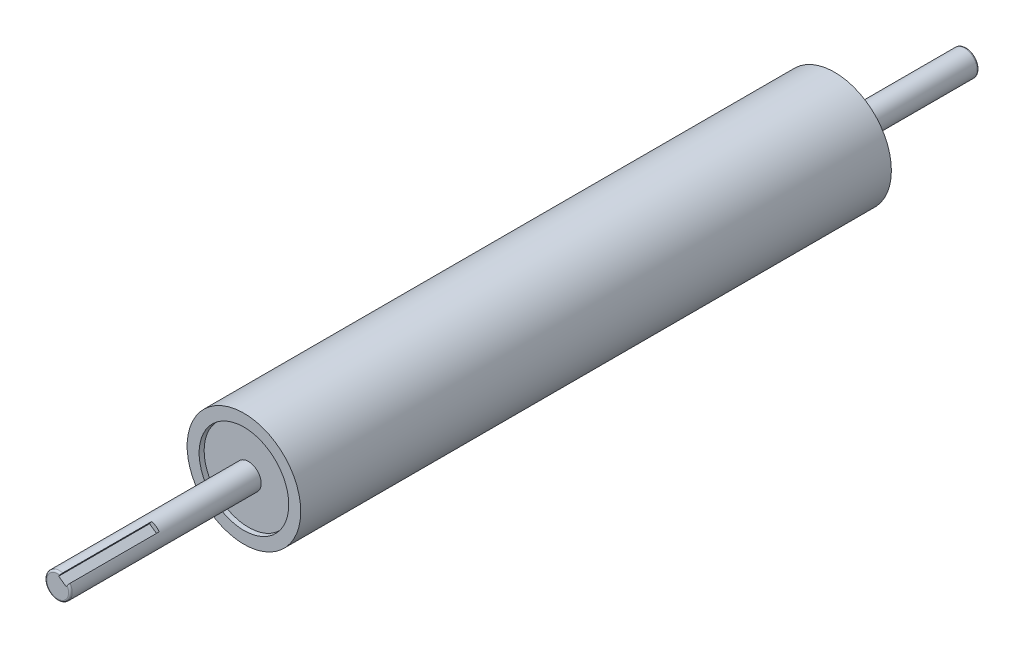
ISO-10303-21;
HEADER;
FILE_DESCRIPTION(('STEP AP214'),'2;1');
FILE_NAME('part.step','',(''),(''),'','','');
FILE_SCHEMA(('AUTOMOTIVE_DESIGN { 1 0 10303 214 1 1 1 1 }'));
ENDSEC;
DATA;
#1=APPLICATION_CONTEXT('core data for automotive mechanical design processes');
#2=APPLICATION_PROTOCOL_DEFINITION('international standard','automotive_design',2000,#1);
#3=PRODUCT_CONTEXT('',#1,'mechanical');
#4=PRODUCT('Part','Part','',(#3));
#5=PRODUCT_RELATED_PRODUCT_CATEGORY('part','',(#4));
#6=PRODUCT_DEFINITION_FORMATION('','',#4);
#7=PRODUCT_DEFINITION_CONTEXT('part definition',#1,'design');
#8=PRODUCT_DEFINITION('design','',#6,#7);
#9=PRODUCT_DEFINITION_SHAPE('','',#8);
#10=(LENGTH_UNIT() NAMED_UNIT(*) SI_UNIT(.MILLI.,.METRE.));
#11=(NAMED_UNIT(*) PLANE_ANGLE_UNIT() SI_UNIT($,.RADIAN.));
#12=(NAMED_UNIT(*) SI_UNIT($,.STERADIAN.) SOLID_ANGLE_UNIT());
#13=UNCERTAINTY_MEASURE_WITH_UNIT(LENGTH_MEASURE(1.E-05),#10,'distance_accuracy_value','');
#14=(GEOMETRIC_REPRESENTATION_CONTEXT(3) GLOBAL_UNCERTAINTY_ASSIGNED_CONTEXT((#13)) GLOBAL_UNIT_ASSIGNED_CONTEXT((#10,
#11,#12)) REPRESENTATION_CONTEXT('',''));
#15=CARTESIAN_POINT('',(0.,0.,0.));
#16=DIRECTION('',(0.,0.,1.));
#17=DIRECTION('',(1.,0.,0.));
#18=AXIS2_PLACEMENT_3D('',#15,#16,#17);
#19=CARTESIAN_POINT('',(286.827371054808,378.107018146906,769.17790576152));
#20=DIRECTION('',(0.,0.,-1.));
#21=DIRECTION('',(-0.695290896147707,0.718728439491661,0.));
#22=AXIS2_PLACEMENT_3D('',#19,#20,#21);
#23=CYLINDRICAL_SURFACE('',#22,48.8);
#24=CARTESIAN_POINT('',(286.827371054808,378.107018146906,769.17790576152));
#25=DIRECTION('',(0.,0.,1.));
#26=DIRECTION('',(0.695290896147707,-0.718728439491661,0.));
#27=AXIS2_PLACEMENT_3D('',#24,#25,#26);
#28=CIRCLE('',#27,48.8);
#29=CARTESIAN_POINT('',(320.757566786816,343.033070299713,769.17790576152));
#30=VERTEX_POINT('',#29);
#31=EDGE_CURVE('P0_E10',#30,#30,#28,.T.);
#32=ORIENTED_EDGE('',*,*,#31,.F.);
#33=EDGE_LOOP('',(#32));
#34=FACE_BOUND('',#33,.T.);
#35=CARTESIAN_POINT('',(286.827371054808,378.107018146906,762.17790576152));
#36=DIRECTION('',(0.,0.,1.));
#37=DIRECTION('',(0.695290896147707,-0.718728439491661,0.));
#38=AXIS2_PLACEMENT_3D('',#35,#36,#37);
#39=CIRCLE('',#38,48.8);
#40=CARTESIAN_POINT('',(320.757566786816,343.033070299713,762.17790576152));
#41=VERTEX_POINT('',#40);
#42=EDGE_CURVE('P0_E17',#41,#41,#39,.T.);
#43=ORIENTED_EDGE('',*,*,#42,.T.);
#44=EDGE_LOOP('',(#43));
#45=FACE_BOUND('',#44,.T.);
#46=ADVANCED_FACE('P0_F14',(#34,#45),#23,.T.);
#47=CARTESIAN_POINT('',(286.827371054808,378.107018146906,769.17790576152));
#48=DIRECTION('',(0.,0.,1.));
#49=DIRECTION('',(0.695290896147707,-0.718728439491661,0.));
#50=AXIS2_PLACEMENT_3D('',#47,#48,#49);
#51=PLANE('',#50);
#52=ORIENTED_EDGE('',*,*,#31,.T.);
#53=EDGE_LOOP('',(#52));
#54=FACE_BOUND('',#53,.T.);
#55=ADVANCED_FACE('P0_F29',(#54),#51,.T.);
#56=CARTESIAN_POINT('',(286.827371054808,378.107018146906,762.17790576152));
#57=DIRECTION('',(0.,0.,1.));
#58=DIRECTION('',(0.695290896147707,-0.718728439491661,0.));
#59=AXIS2_PLACEMENT_3D('',#56,#57,#58);
#60=PLANE('',#59);
#61=ORIENTED_EDGE('',*,*,#42,.F.);
#62=EDGE_LOOP('',(#61));
#63=FACE_BOUND('',#62,.T.);
#64=ADVANCED_FACE('P0_F27',(#63),#60,.F.);
#65=CLOSED_SHELL('',(#46,#55,#64));
#66=MANIFOLD_SOLID_BREP('P0_B1',#65);
#67=CARTESIAN_POINT('',(286.827371054808,378.107018146906,769.17790576152));
#68=DIRECTION('',(0.,0.,1.));
#69=DIRECTION('',(0.581871758152721,0.813280552493579,0.));
#70=AXIS2_PLACEMENT_3D('',#67,#68,#69);
#71=CYLINDRICAL_SURFACE('',#70,14.);
#72=CARTESIAN_POINT('',(286.827371054808,378.107018146906,769.17790576152));
#73=DIRECTION('',(0.,0.,-1.));
#74=DIRECTION('',(-0.581871758152721,-0.813280552493579,0.));
#75=AXIS2_PLACEMENT_3D('',#72,#73,#74);
#76=CIRCLE('',#75,14.);
#77=CARTESIAN_POINT('',(278.68116644067,366.721090411996,769.17790576152));
#78=VERTEX_POINT('',#77);
#79=EDGE_CURVE('P1_E99',#78,#78,#76,.T.);
#80=ORIENTED_EDGE('',*,*,#79,.F.);
#81=EDGE_LOOP('',(#80));
#82=FACE_BOUND('',#81,.T.);
#83=DIRECTION('',(0.,0.,1.));
#84=VECTOR('',#83,1.);
#85=CARTESIAN_POINT('',(298.50273439294,385.832682579342,769.17790576152));
#86=LINE('',#85,#84);
#87=CARTESIAN_POINT('',(298.50273439294,385.832682579342,879.17790576152));
#88=VERTEX_POINT('',#87);
#89=CARTESIAN_POINT('',(298.50273439294,385.832682579342,977.17790576152));
#90=VERTEX_POINT('',#89);
#91=EDGE_CURVE('P1_E96',#88,#90,#86,.T.);
#92=ORIENTED_EDGE('',*,*,#91,.T.);
#93=CARTESIAN_POINT('',(286.827371054808,378.107018146906,977.17790576152));
#94=DIRECTION('',(0.,0.,-1.));
#95=DIRECTION('',(-0.581871758152721,-0.813280552493579,0.));
#96=AXIS2_PLACEMENT_3D('',#93,#94,#95);
#97=CIRCLE('',#96,14.);
#98=CARTESIAN_POINT('',(290.369928868004,391.651400160869,977.17790576152));
#99=VERTEX_POINT('',#98);
#100=EDGE_CURVE('P1_E108',#90,#99,#97,.T.);
#101=ORIENTED_EDGE('',*,*,#100,.T.);
#102=DIRECTION('',(0.,0.,1.));
#103=VECTOR('',#102,1.);
#104=CARTESIAN_POINT('',(290.369928868004,391.651400160869,769.17790576152));
#105=LINE('',#104,#103);
#106=CARTESIAN_POINT('',(290.369928868004,391.651400160869,879.17790576152));
#107=VERTEX_POINT('',#106);
#108=EDGE_CURVE('P1_E93',#99,#107,#105,.F.);
#109=ORIENTED_EDGE('',*,*,#108,.T.);
#110=CARTESIAN_POINT('',(286.827371054808,378.107018146906,879.17790576152));
#111=DIRECTION('',(0.,0.,-1.));
#112=DIRECTION('',(-0.581871758152721,-0.813280552493579,0.));
#113=AXIS2_PLACEMENT_3D('',#110,#111,#112);
#114=CIRCLE('',#113,14.);
#115=EDGE_CURVE('P1_E76',#107,#88,#114,.T.);
#116=ORIENTED_EDGE('',*,*,#115,.T.);
#117=EDGE_LOOP('',(#92,#101,#109,#116));
#118=FACE_BOUND('',#117,.T.);
#119=ADVANCED_FACE('P1_F16',(#82,#118),#71,.T.);
#120=CARTESIAN_POINT('',(286.827371054808,378.107018146906,769.17790576152));
#121=DIRECTION('',(0.,0.,-1.));
#122=DIRECTION('',(-0.581871758152721,-0.813280552493579,0.));
#123=AXIS2_PLACEMENT_3D('',#120,#121,#122);
#124=PLANE('',#123);
#125=ORIENTED_EDGE('',*,*,#79,.T.);
#126=EDGE_LOOP('',(#125));
#127=FACE_BOUND('',#126,.T.);
#128=ADVANCED_FACE('P1_F125',(#127),#124,.T.);
#129=CARTESIAN_POINT('',(286.827371054808,378.107018146906,979.17790576152));
#130=DIRECTION('',(0.,0.,-1.));
#131=DIRECTION('',(-0.581871758152721,-0.813280552493579,0.));
#132=AXIS2_PLACEMENT_3D('',#129,#130,#131);
#133=PLANE('',#132);
#134=DIRECTION('',(0.581871758152721,0.813280552493579,0.));
#135=VECTOR('',#134,1.);
#136=CARTESIAN_POINT('',(282.76096829234,381.01637693767,979.17790576152));
#137=LINE('',#136,#135);
#138=CARTESIAN_POINT('',(287.997814115714,388.335901910112,979.17790576152));
#139=VERTEX_POINT('',#138);
#140=CARTESIAN_POINT('',(289.108439789665,389.888220353254,979.17790576152));
#141=VERTEX_POINT('',#140);
#142=EDGE_CURVE('P1_E82',#139,#141,#137,.T.);
#143=ORIENTED_EDGE('',*,*,#142,.T.);
#144=CARTESIAN_POINT('',(286.827371054808,378.107018146906,979.17790576152));
#145=DIRECTION('',(0.,0.,-1.));
#146=DIRECTION('',(-0.581871758152721,-0.813280552493579,0.));
#147=AXIS2_PLACEMENT_3D('',#144,#145,#146);
#148=CIRCLE('',#147,12.);
#149=CARTESIAN_POINT('',(297.241245314601,384.069502771727,979.17790576152));
#150=VERTEX_POINT('',#149);
#151=EDGE_CURVE('P1_E30',#141,#150,#148,.F.);
#152=ORIENTED_EDGE('',*,*,#151,.T.);
#153=DIRECTION('',(-0.581871758152721,-0.813280552493579,0.));
#154=VECTOR('',#153,1.);
#155=CARTESIAN_POINT('',(290.893773817276,375.197659356143,979.17790576152));
#156=LINE('',#155,#154);
#157=CARTESIAN_POINT('',(296.13061964065,382.517184328585,979.17790576152));
#158=VERTEX_POINT('',#157);
#159=EDGE_CURVE('P1_E105',#150,#158,#156,.T.);
#160=ORIENTED_EDGE('',*,*,#159,.T.);
#161=DIRECTION('',(-0.813280552493579,0.581871758152721,0.));
#162=VECTOR('',#161,1.);
#163=CARTESIAN_POINT('',(292.064216878182,385.426543119349,979.17790576152));
#164=LINE('',#163,#162);
#165=EDGE_CURVE('P1_E102',#158,#139,#164,.T.);
#166=ORIENTED_EDGE('',*,*,#165,.T.);
#167=EDGE_LOOP('',(#143,#152,#160,#166));
#168=FACE_BOUND('',#167,.T.);
#169=ADVANCED_FACE('P1_F124',(#168),#133,.F.);
#170=CARTESIAN_POINT('',(296.13061964065,382.517184328585,879.17790576152));
#171=DIRECTION('',(0.,0.,-1.));
#172=DIRECTION('',(-0.581871758152721,-0.813280552493579,0.));
#173=AXIS2_PLACEMENT_3D('',#170,#171,#172);
#174=PLANE('',#173);
#175=DIRECTION('',(0.581871758152721,0.813280552493579,0.));
#176=VECTOR('',#175,1.);
#177=CARTESIAN_POINT('',(287.997814115714,388.335901910112,879.17790576152));
#178=LINE('',#177,#176);
#179=CARTESIAN_POINT('',(287.997814115714,388.335901910112,879.17790576152));
#180=VERTEX_POINT('',#179);
#181=EDGE_CURVE('P1_E69',#180,#107,#178,.T.);
#182=ORIENTED_EDGE('',*,*,#181,.F.);
#183=DIRECTION('',(-0.813280552493579,0.581871758152721,0.));
#184=VECTOR('',#183,1.);
#185=CARTESIAN_POINT('',(296.13061964065,382.517184328585,879.17790576152));
#186=LINE('',#185,#184);
#187=CARTESIAN_POINT('',(296.13061964065,382.517184328585,879.17790576152));
#188=VERTEX_POINT('',#187);
#189=EDGE_CURVE('P1_E74',#188,#180,#186,.T.);
#190=ORIENTED_EDGE('',*,*,#189,.F.);
#191=DIRECTION('',(0.581871758152721,0.813280552493579,0.));
#192=VECTOR('',#191,1.);
#193=CARTESIAN_POINT('',(296.13061964065,382.517184328585,879.17790576152));
#194=LINE('',#193,#192);
#195=EDGE_CURVE('P1_E77',#188,#88,#194,.T.);
#196=ORIENTED_EDGE('',*,*,#195,.T.);
#197=ORIENTED_EDGE('',*,*,#115,.F.);
#198=EDGE_LOOP('',(#182,#190,#196,#197));
#199=FACE_BOUND('',#198,.T.);
#200=ADVANCED_FACE('P1_F71',(#199),#174,.F.);
#201=CARTESIAN_POINT('',(296.13061964065,382.517184328585,1079.17790576152));
#202=DIRECTION('',(0.813280552493579,-0.581871758152721,0.));
#203=DIRECTION('',(0.,0.,1.));
#204=AXIS2_PLACEMENT_3D('',#201,#202,#203);
#205=PLANE('',#204);
#206=ORIENTED_EDGE('',*,*,#159,.F.);
#207=CARTESIAN_POINT('',(297.241245314601,384.069502771727,979.17790576152));
#208=CARTESIAN_POINT('',(297.279303389889,384.122696438654,979.177902425945));
#209=CARTESIAN_POINT('',(297.317345846208,384.175868274991,979.175252635181));
#210=CARTESIAN_POINT('',(297.393186863127,384.281871055289,979.164612217975));
#211=CARTESIAN_POINT('',(297.430985354312,384.334701902231,979.156620133786));
#212=CARTESIAN_POINT('',(297.543798987845,384.492381206859,979.124522391278));
#213=CARTESIAN_POINT('',(297.618094343217,384.596223620274,979.092294882061));
#214=CARTESIAN_POINT('',(297.762502412137,384.798062380155,979.006291965909));
#215=CARTESIAN_POINT('',(297.832605948121,384.896045899166,978.9524711344));
#216=CARTESIAN_POINT('',(297.966008459854,385.082502222104,978.824123010813));
#217=CARTESIAN_POINT('',(298.029316625435,385.170987870633,978.749624184956));
#218=CARTESIAN_POINT('',(298.143114435191,385.330042755656,978.586725123294));
#219=CARTESIAN_POINT('',(298.194151811163,385.401377555372,978.499456299433));
#220=CARTESIAN_POINT('',(298.286112765859,385.529911128269,978.310290677699));
#221=CARTESIAN_POINT('',(298.327036229341,385.587109740377,978.20839371317));
#222=CARTESIAN_POINT('',(298.394221623131,385.681014580086,978.001565235274));
#223=CARTESIAN_POINT('',(298.421377311832,385.718970011331,977.897488386661));
#224=CARTESIAN_POINT('',(298.464416695688,385.779126039512,977.68274935303));
#225=CARTESIAN_POINT('',(298.480319636245,385.801353535693,977.572098764131));
#226=CARTESIAN_POINT('',(298.494424170834,385.821067404811,977.413320735935));
#227=CARTESIAN_POINT('',(298.497540304744,385.825422816588,977.366359937179));
#228=CARTESIAN_POINT('',(298.501693228198,385.831227346253,977.272242821652));
#229=CARTESIAN_POINT('',(298.502733323643,385.832681084789,977.225086935745));
#230=CARTESIAN_POINT('',(298.50273439294,385.832682579342,977.17790576152));
#231=B_SPLINE_CURVE_WITH_KNOTS('',3,(#207,#208,#209,#210,#211,#212,#213,#214,#215,#216,#217,
#218,#219,#220,#221,#222,#223,#224,#225,#226,#227,#228,#229,#230),.UNSPECIFIED.,.F.,.F.,(4,2,2,
2,2,2,2,2,2,2,2,4),(0.,0.196108850562428,0.392271235035995,0.785298574524055,1.17915707378606,
1.57247603685628,1.94169629577519,2.31092076150769,2.65138418699848,2.99126390643544,
3.13294919480883,3.27440868173185),.UNSPECIFIED.);
#232=EDGE_CURVE('P1_E11',#150,#90,#231,.T.);
#233=ORIENTED_EDGE('',*,*,#232,.T.);
#234=ORIENTED_EDGE('',*,*,#91,.F.);
#235=ORIENTED_EDGE('',*,*,#195,.F.);
#236=DIRECTION('',(0.,0.,-1.));
#237=VECTOR('',#236,1.);
#238=CARTESIAN_POINT('',(296.13061964065,382.517184328585,1079.17790576152));
#239=LINE('',#238,#237);
#240=EDGE_CURVE('P1_E78',#158,#188,#239,.T.);
#241=ORIENTED_EDGE('',*,*,#240,.F.);
#242=EDGE_LOOP('',(#206,#233,#234,#235,#241));
#243=FACE_BOUND('',#242,.T.);
#244=ADVANCED_FACE('P1_F119',(#243),#205,.F.);
#245=CARTESIAN_POINT('',(287.997814115714,388.335901910112,1079.17790576152));
#246=DIRECTION('',(-0.813280552493579,0.581871758152721,0.));
#247=DIRECTION('',(0.,0.,-1.));
#248=AXIS2_PLACEMENT_3D('',#245,#246,#247);
#249=PLANE('',#248);
#250=ORIENTED_EDGE('',*,*,#108,.F.);
#251=CARTESIAN_POINT('',(290.369928868004,391.651400160869,977.17790576152));
#252=CARTESIAN_POINT('',(290.369933127307,391.651406114085,977.23136363431));
#253=CARTESIAN_POINT('',(290.368593753826,391.649534075463,977.284817989868));
#254=CARTESIAN_POINT('',(290.363260468639,391.642079757457,977.391325608394));
#255=CARTESIAN_POINT('',(290.359266992768,391.63649808724,977.444378935769));
#256=CARTESIAN_POINT('',(290.348670830795,391.621687860857,977.54958294238));
#257=CARTESIAN_POINT('',(290.342074375289,391.61246801318,977.601735468923));
#258=CARTESIAN_POINT('',(290.326341874232,391.590478739817,977.704882005307));
#259=CARTESIAN_POINT('',(290.317205804124,391.57770927981,977.755876003942));
#260=CARTESIAN_POINT('',(290.286104715872,391.534239374488,977.906576639673));
#261=CARTESIAN_POINT('',(290.260436144294,391.498362482746,978.004106552136));
#262=CARTESIAN_POINT('',(290.200166978344,391.414124435624,978.190577356165));
#263=CARTESIAN_POINT('',(290.165563813689,391.365759687767,978.279515766015));
#264=CARTESIAN_POINT('',(290.087617398865,391.256814198619,978.448851457558));
#265=CARTESIAN_POINT('',(290.044080011221,391.195962111917,978.528984673694));
#266=CARTESIAN_POINT('',(289.950210605671,391.064761102522,978.676436838794));
#267=CARTESIAN_POINT('',(289.899877468051,390.994410614809,978.743753671633));
#268=CARTESIAN_POINT('',(289.790533946449,390.841581476061,978.868207922608));
#269=CARTESIAN_POINT('',(289.73117800154,390.758619835471,978.92444736277));
#270=CARTESIAN_POINT('',(289.60807659938,390.58656134499,979.020396082957));
#271=CARTESIAN_POINT('',(289.544328261752,390.497460469203,979.06009439332));
#272=CARTESIAN_POINT('',(289.418902844796,390.322153709648,979.120266824002));
#273=CARTESIAN_POINT('',(289.357417906289,390.236216380574,979.141939450811));
#274=CARTESIAN_POINT('',(289.233427447015,390.062915257416,979.170758293397));
#275=CARTESIAN_POINT('',(289.170924214515,389.975554661634,979.177933488553));
#276=CARTESIAN_POINT('',(289.108439789665,389.888220353254,979.17790576152));
#277=B_SPLINE_CURVE_WITH_KNOTS('',3,(#251,#252,#253,#254,#255,#256,#257,#258,#259,#260,#261,
#262,#263,#264,#265,#266,#267,#268,#269,#270,#271,#272,#273,#274,#275,#276),.UNSPECIFIED.,.F.,
.F.,(4,2,2,2,2,2,2,2,2,2,2,2,4),(0.,0.16031800786455,0.320609696091337,0.480520008666252,
0.640431867500968,0.959940917401134,1.27954198551281,1.60700850170679,1.93452903944632,
2.28249861281501,2.63069858499944,2.95330615263974,3.27526820915385),.UNSPECIFIED.);
#278=EDGE_CURVE('P1_E44',#99,#141,#277,.T.);
#279=ORIENTED_EDGE('',*,*,#278,.T.);
#280=ORIENTED_EDGE('',*,*,#142,.F.);
#281=DIRECTION('',(0.,0.,1.));
#282=VECTOR('',#281,1.);
#283=CARTESIAN_POINT('',(287.997814115714,388.335901910112,1079.17790576152));
#284=LINE('',#283,#282);
#285=EDGE_CURVE('P1_E80',#180,#139,#284,.T.);
#286=ORIENTED_EDGE('',*,*,#285,.F.);
#287=ORIENTED_EDGE('',*,*,#181,.T.);
#288=EDGE_LOOP('',(#250,#279,#280,#286,#287));
#289=FACE_BOUND('',#288,.T.);
#290=ADVANCED_FACE('P1_F81',(#289),#249,.F.);
#291=CARTESIAN_POINT('',(292.064216878182,385.426543119349,979.17790576152));
#292=DIRECTION('',(-0.581871758152721,-0.813280552493579,0.));
#293=DIRECTION('',(0.,0.,1.));
#294=AXIS2_PLACEMENT_3D('',#291,#292,#293);
#295=PLANE('',#294);
#296=ORIENTED_EDGE('',*,*,#240,.T.);
#297=ORIENTED_EDGE('',*,*,#189,.T.);
#298=ORIENTED_EDGE('',*,*,#285,.T.);
#299=ORIENTED_EDGE('',*,*,#165,.F.);
#300=EDGE_LOOP('',(#296,#297,#298,#299));
#301=FACE_BOUND('',#300,.T.);
#302=ADVANCED_FACE('P1_F87',(#301),#295,.F.);
#303=CARTESIAN_POINT('',(286.827371054808,378.107018146906,977.17790576152));
#304=DIRECTION('',(0.,0.,-1.));
#305=DIRECTION('',(-0.581871758152721,-0.813280552493579,0.));
#306=AXIS2_PLACEMENT_3D('',#303,#304,#305);
#307=TOROIDAL_SURFACE('',#306,12.,2.);
#308=ORIENTED_EDGE('',*,*,#232,.F.);
#309=ORIENTED_EDGE('',*,*,#151,.F.);
#310=ORIENTED_EDGE('',*,*,#278,.F.);
#311=ORIENTED_EDGE('',*,*,#100,.F.);
#312=EDGE_LOOP('',(#308,#309,#310,#311));
#313=FACE_BOUND('',#312,.T.);
#314=ADVANCED_FACE('P1_F18',(#313),#307,.T.);
#315=CLOSED_SHELL('',(#119,#128,#169,#200,#244,#290,#302,#314));
#316=MANIFOLD_SOLID_BREP('P1_B1',#315);
#317=CARTESIAN_POINT('',(286.827371054808,378.107018146906,903.82967862079));
#318=DIRECTION('',(0.,0.,1.));
#319=DIRECTION('',(1.,0.,0.));
#320=AXIS2_PLACEMENT_3D('',#317,#318,#319);
#321=CYLINDRICAL_SURFACE('',#320,62.5);
#322=CARTESIAN_POINT('',(286.827371054808,378.107018146906,774.17790576152));
#323=DIRECTION('',(0.,0.,1.));
#324=DIRECTION('',(1.,0.,0.));
#325=AXIS2_PLACEMENT_3D('',#322,#323,#324);
#326=CIRCLE('',#325,62.5);
#327=CARTESIAN_POINT('',(349.327371054808,378.107018146906,774.17790576152));
#328=VERTEX_POINT('',#327);
#329=EDGE_CURVE('P2_E29',#328,#328,#326,.T.);
#330=ORIENTED_EDGE('',*,*,#329,.F.);
#331=EDGE_LOOP('',(#330));
#332=FACE_BOUND('',#331,.T.);
#333=CARTESIAN_POINT('',(286.827371054808,378.107018146906,124.17790576152));
#334=DIRECTION('',(0.,0.,1.));
#335=DIRECTION('',(1.,0.,0.));
#336=AXIS2_PLACEMENT_3D('',#333,#334,#335);
#337=CIRCLE('',#336,62.5);
#338=CARTESIAN_POINT('',(349.327371054808,378.107018146906,124.17790576152));
#339=VERTEX_POINT('',#338);
#340=EDGE_CURVE('P2_E10',#339,#339,#337,.T.);
#341=ORIENTED_EDGE('',*,*,#340,.T.);
#342=EDGE_LOOP('',(#341));
#343=FACE_BOUND('',#342,.T.);
#344=ADVANCED_FACE('P2_F15',(#332,#343),#321,.T.);
#345=CARTESIAN_POINT('',(286.827371054808,440.607018146906,124.17790576152));
#346=DIRECTION('',(0.,0.,1.));
#347=DIRECTION('',(1.,0.,0.));
#348=AXIS2_PLACEMENT_3D('',#345,#346,#347);
#349=PLANE('',#348);
#350=ORIENTED_EDGE('',*,*,#340,.F.);
#351=EDGE_LOOP('',(#350));
#352=FACE_BOUND('',#351,.T.);
#353=CARTESIAN_POINT('',(286.827371054808,378.107018146906,124.17790576152));
#354=DIRECTION('',(0.,0.,1.));
#355=DIRECTION('',(1.,0.,0.));
#356=AXIS2_PLACEMENT_3D('',#353,#354,#355);
#357=CIRCLE('',#356,49.3000000000001);
#358=CARTESIAN_POINT('',(336.127371054808,378.107018146906,124.17790576152));
#359=VERTEX_POINT('',#358);
#360=EDGE_CURVE('P2_E21',#359,#359,#357,.T.);
#361=ORIENTED_EDGE('',*,*,#360,.T.);
#362=EDGE_LOOP('',(#361));
#363=FACE_BOUND('',#362,.T.);
#364=ADVANCED_FACE('P2_F38',(#352,#363),#349,.F.);
#365=CARTESIAN_POINT('',(286.827371054808,378.107018146906,903.82967862079));
#366=DIRECTION('',(0.,0.,1.));
#367=DIRECTION('',(1.,0.,0.));
#368=AXIS2_PLACEMENT_3D('',#365,#366,#367);
#369=CYLINDRICAL_SURFACE('',#368,49.3);
#370=ORIENTED_EDGE('',*,*,#360,.F.);
#371=EDGE_LOOP('',(#370));
#372=FACE_BOUND('',#371,.T.);
#373=CARTESIAN_POINT('',(286.827371054808,378.107018146906,774.17790576152));
#374=DIRECTION('',(0.,0.,1.));
#375=DIRECTION('',(1.,0.,0.));
#376=AXIS2_PLACEMENT_3D('',#373,#374,#375);
#377=CIRCLE('',#376,49.3);
#378=CARTESIAN_POINT('',(336.127371054808,378.107018146906,774.17790576152));
#379=VERTEX_POINT('',#378);
#380=EDGE_CURVE('P2_E25',#379,#379,#377,.T.);
#381=ORIENTED_EDGE('',*,*,#380,.T.);
#382=EDGE_LOOP('',(#381));
#383=FACE_BOUND('',#382,.T.);
#384=ADVANCED_FACE('P2_F43',(#372,#383),#369,.F.);
#385=CARTESIAN_POINT('',(286.827371054808,427.407018146906,774.17790576152));
#386=DIRECTION('',(0.,0.,-1.));
#387=DIRECTION('',(-1.,0.,0.));
#388=AXIS2_PLACEMENT_3D('',#385,#386,#387);
#389=PLANE('',#388);
#390=ORIENTED_EDGE('',*,*,#380,.F.);
#391=EDGE_LOOP('',(#390));
#392=FACE_BOUND('',#391,.T.);
#393=ORIENTED_EDGE('',*,*,#329,.T.);
#394=EDGE_LOOP('',(#393));
#395=FACE_BOUND('',#394,.T.);
#396=ADVANCED_FACE('P2_F35',(#392,#395),#389,.F.);
#397=CLOSED_SHELL('',(#344,#364,#384,#396));
#398=MANIFOLD_SOLID_BREP('P2_B1',#397);
#399=CARTESIAN_POINT('',(286.827371054808,378.107018146907,136.17790576152));
#400=DIRECTION('',(0.,0.,-1.));
#401=DIRECTION('',(-0.994143241155769,0.108070421782756,0.));
#402=AXIS2_PLACEMENT_3D('',#399,#400,#401);
#403=CYLINDRICAL_SURFACE('',#402,48.8);
#404=CARTESIAN_POINT('',(286.827371054808,378.107018146907,136.17790576152));
#405=DIRECTION('',(0.,0.,1.));
#406=DIRECTION('',(0.994143241155769,-0.108070421782756,0.));
#407=AXIS2_PLACEMENT_3D('',#404,#405,#406);
#408=CIRCLE('',#407,48.8);
#409=CARTESIAN_POINT('',(335.341561223209,372.833181563908,136.17790576152));
#410=VERTEX_POINT('',#409);
#411=EDGE_CURVE('P3_E10',#410,#410,#408,.T.);
#412=ORIENTED_EDGE('',*,*,#411,.F.);
#413=EDGE_LOOP('',(#412));
#414=FACE_BOUND('',#413,.T.);
#415=CARTESIAN_POINT('',(286.827371054808,378.107018146907,129.17790576152));
#416=DIRECTION('',(0.,0.,1.));
#417=DIRECTION('',(0.994143241155769,-0.108070421782756,0.));
#418=AXIS2_PLACEMENT_3D('',#415,#416,#417);
#419=CIRCLE('',#418,48.8);
#420=CARTESIAN_POINT('',(335.341561223209,372.833181563908,129.17790576152));
#421=VERTEX_POINT('',#420);
#422=EDGE_CURVE('P3_E17',#421,#421,#419,.T.);
#423=ORIENTED_EDGE('',*,*,#422,.T.);
#424=EDGE_LOOP('',(#423));
#425=FACE_BOUND('',#424,.T.);
#426=ADVANCED_FACE('P3_F14',(#414,#425),#403,.T.);
#427=CARTESIAN_POINT('',(286.827371054808,378.107018146907,136.17790576152));
#428=DIRECTION('',(0.,0.,1.));
#429=DIRECTION('',(0.994143241155769,-0.108070421782756,0.));
#430=AXIS2_PLACEMENT_3D('',#427,#428,#429);
#431=PLANE('',#430);
#432=ORIENTED_EDGE('',*,*,#411,.T.);
#433=EDGE_LOOP('',(#432));
#434=FACE_BOUND('',#433,.T.);
#435=ADVANCED_FACE('P3_F29',(#434),#431,.T.);
#436=CARTESIAN_POINT('',(286.827371054808,378.107018146907,129.17790576152));
#437=DIRECTION('',(0.,0.,1.));
#438=DIRECTION('',(0.994143241155769,-0.108070421782756,0.));
#439=AXIS2_PLACEMENT_3D('',#436,#437,#438);
#440=PLANE('',#439);
#441=ORIENTED_EDGE('',*,*,#422,.F.);
#442=EDGE_LOOP('',(#441));
#443=FACE_BOUND('',#442,.T.);
#444=ADVANCED_FACE('P3_F27',(#443),#440,.F.);
#445=CLOSED_SHELL('',(#426,#435,#444));
#446=MANIFOLD_SOLID_BREP('P3_B1',#445);
#447=CARTESIAN_POINT('',(286.827371054808,378.107018146906,-20.8220942384798));
#448=DIRECTION('',(0.,0.,1.));
#449=DIRECTION('',(0.835541227028058,-0.549427754974618,0.));
#450=AXIS2_PLACEMENT_3D('',#447,#448,#449);
#451=CYLINDRICAL_SURFACE('',#450,14.);
#452=CARTESIAN_POINT('',(286.827371054808,378.107018146906,-18.8220942384798));
#453=DIRECTION('',(0.,0.,-1.));
#454=DIRECTION('',(-0.835541227028058,0.549427754974618,0.));
#455=AXIS2_PLACEMENT_3D('',#452,#453,#454);
#456=CIRCLE('',#455,14.);
#457=CARTESIAN_POINT('',(275.129793876415,385.799006716551,-18.8220942384798));
#458=VERTEX_POINT('',#457);
#459=EDGE_CURVE('P4_E10',#458,#458,#456,.F.);
#460=ORIENTED_EDGE('',*,*,#459,.T.);
#461=EDGE_LOOP('',(#460));
#462=FACE_BOUND('',#461,.T.);
#463=CARTESIAN_POINT('',(286.827371054808,378.107018146906,129.17790576152));
#464=DIRECTION('',(0.,0.,-1.));
#465=DIRECTION('',(-0.835541227028058,0.549427754974618,0.));
#466=AXIS2_PLACEMENT_3D('',#463,#464,#465);
#467=CIRCLE('',#466,14.);
#468=CARTESIAN_POINT('',(275.129793876415,385.799006716551,129.17790576152));
#469=VERTEX_POINT('',#468);
#470=EDGE_CURVE('P4_E25',#469,#469,#467,.T.);
#471=ORIENTED_EDGE('',*,*,#470,.T.);
#472=EDGE_LOOP('',(#471));
#473=FACE_BOUND('',#472,.T.);
#474=ADVANCED_FACE('P4_F14',(#462,#473),#451,.T.);
#475=CARTESIAN_POINT('',(286.827371054808,378.107018146906,-20.8220942384798));
#476=DIRECTION('',(0.,0.,-1.));
#477=DIRECTION('',(-0.835541227028058,0.549427754974618,0.));
#478=AXIS2_PLACEMENT_3D('',#475,#476,#477);
#479=PLANE('',#478);
#480=CARTESIAN_POINT('',(286.827371054808,378.107018146906,-20.8220942384798));
#481=DIRECTION('',(0.,0.,-1.));
#482=DIRECTION('',(-0.835541227028058,0.549427754974618,0.));
#483=AXIS2_PLACEMENT_3D('',#480,#481,#482);
#484=CIRCLE('',#483,12.);
#485=CARTESIAN_POINT('',(276.800876330471,384.700151206602,-20.8220942384798));
#486=VERTEX_POINT('',#485);
#487=EDGE_CURVE('P4_E21',#486,#486,#484,.T.);
#488=ORIENTED_EDGE('',*,*,#487,.T.);
#489=EDGE_LOOP('',(#488));
#490=FACE_BOUND('',#489,.T.);
#491=ADVANCED_FACE('P4_F35',(#490),#479,.T.);
#492=CARTESIAN_POINT('',(286.827371054808,378.107018146906,129.17790576152));
#493=DIRECTION('',(0.,0.,-1.));
#494=DIRECTION('',(-0.835541227028058,0.549427754974618,0.));
#495=AXIS2_PLACEMENT_3D('',#492,#493,#494);
#496=PLANE('',#495);
#497=ORIENTED_EDGE('',*,*,#470,.F.);
#498=EDGE_LOOP('',(#497));
#499=FACE_BOUND('',#498,.T.);
#500=ADVANCED_FACE('P4_F33',(#499),#496,.F.);
#501=CARTESIAN_POINT('',(286.827371054808,378.107018146906,-18.8220942384798));
#502=DIRECTION('',(0.,0.,-1.));
#503=DIRECTION('',(-0.835541227028058,0.549427754974618,0.));
#504=AXIS2_PLACEMENT_3D('',#501,#502,#503);
#505=TOROIDAL_SURFACE('',#504,12.,2.);
#506=ORIENTED_EDGE('',*,*,#459,.F.);
#507=EDGE_LOOP('',(#506));
#508=FACE_BOUND('',#507,.T.);
#509=ORIENTED_EDGE('',*,*,#487,.F.);
#510=EDGE_LOOP('',(#509));
#511=FACE_BOUND('',#510,.T.);
#512=ADVANCED_FACE('P4_F16',(#508,#511),#505,.T.);
#513=CLOSED_SHELL('',(#474,#491,#500,#512));
#514=MANIFOLD_SOLID_BREP('P4_B1',#513);
#515=ADVANCED_BREP_SHAPE_REPRESENTATION('',(#18,#66,#316,#398,#446,#514),#14);
#516=SHAPE_DEFINITION_REPRESENTATION(#9,#515);
ENDSEC;
END-ISO-10303-21;
